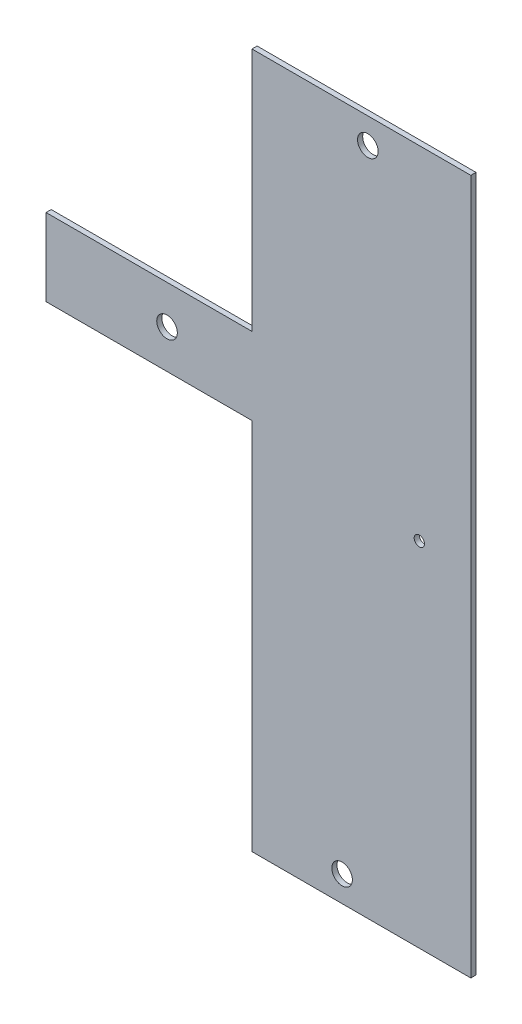
ISO-10303-21;
HEADER;
FILE_DESCRIPTION(('STEP AP214'),'2;1');
FILE_NAME('part.step','',(''),(''),'','','');
FILE_SCHEMA(('AUTOMOTIVE_DESIGN { 1 0 10303 214 1 1 1 1 }'));
ENDSEC;
DATA;
#1=APPLICATION_CONTEXT('core data for automotive mechanical design processes');
#2=APPLICATION_PROTOCOL_DEFINITION('international standard','automotive_design',2000,#1);
#3=PRODUCT_CONTEXT('',#1,'mechanical');
#4=PRODUCT('Part','Part','',(#3));
#5=PRODUCT_RELATED_PRODUCT_CATEGORY('part','',(#4));
#6=PRODUCT_DEFINITION_FORMATION('','',#4);
#7=PRODUCT_DEFINITION_CONTEXT('part definition',#1,'design');
#8=PRODUCT_DEFINITION('design','',#6,#7);
#9=PRODUCT_DEFINITION_SHAPE('','',#8);
#10=(LENGTH_UNIT() NAMED_UNIT(*) SI_UNIT(.MILLI.,.METRE.));
#11=(NAMED_UNIT(*) PLANE_ANGLE_UNIT() SI_UNIT($,.RADIAN.));
#12=(NAMED_UNIT(*) SI_UNIT($,.STERADIAN.) SOLID_ANGLE_UNIT());
#13=UNCERTAINTY_MEASURE_WITH_UNIT(LENGTH_MEASURE(1.E-05),#10,'distance_accuracy_value','');
#14=(GEOMETRIC_REPRESENTATION_CONTEXT(3) GLOBAL_UNCERTAINTY_ASSIGNED_CONTEXT((#13)) GLOBAL_UNIT_ASSIGNED_CONTEXT((#10,
#11,#12)) REPRESENTATION_CONTEXT('',''));
#15=CARTESIAN_POINT('',(0.,0.,0.));
#16=DIRECTION('',(0.,0.,1.));
#17=DIRECTION('',(1.,0.,0.));
#18=AXIS2_PLACEMENT_3D('',#15,#16,#17);
#19=CARTESIAN_POINT('',(-71.5961399548884,-15.3968397565747,2.));
#20=DIRECTION('',(1.,0.,0.));
#21=DIRECTION('',(0.,0.,-1.));
#22=AXIS2_PLACEMENT_3D('',#19,#20,#21);
#23=PLANE('',#22);
#24=DIRECTION('',(0.,-1.,0.));
#25=VECTOR('',#24,1.);
#26=CARTESIAN_POINT('',(-71.5961399548884,-15.3968397565747,0.));
#27=LINE('',#26,#25);
#28=CARTESIAN_POINT('',(-71.5961399548884,14.6031602434253,0.));
#29=VERTEX_POINT('',#28);
#30=CARTESIAN_POINT('',(-71.5961399548884,-15.3968397565747,0.));
#31=VERTEX_POINT('',#30);
#32=EDGE_CURVE('E129',#29,#31,#27,.T.);
#33=ORIENTED_EDGE('',*,*,#32,.T.);
#34=DIRECTION('',(0.,0.,-1.));
#35=VECTOR('',#34,1.);
#36=CARTESIAN_POINT('',(-71.5961399548884,-15.3968397565747,2.));
#37=LINE('',#36,#35);
#38=CARTESIAN_POINT('',(-71.5961399548884,-15.3968397565747,2.));
#39=VERTEX_POINT('',#38);
#40=EDGE_CURVE('E11',#39,#31,#37,.T.);
#41=ORIENTED_EDGE('',*,*,#40,.F.);
#42=DIRECTION('',(0.,-1.,0.));
#43=VECTOR('',#42,1.);
#44=CARTESIAN_POINT('',(-71.5961399548884,-15.3968397565747,2.));
#45=LINE('',#44,#43);
#46=CARTESIAN_POINT('',(-71.5961399548884,14.6031602434253,2.));
#47=VERTEX_POINT('',#46);
#48=EDGE_CURVE('E144',#47,#39,#45,.T.);
#49=ORIENTED_EDGE('',*,*,#48,.F.);
#50=DIRECTION('',(0.,0.,-1.));
#51=VECTOR('',#50,1.);
#52=CARTESIAN_POINT('',(-71.5961399548884,14.6031602434253,2.));
#53=LINE('',#52,#51);
#54=EDGE_CURVE('E125',#47,#29,#53,.T.);
#55=ORIENTED_EDGE('',*,*,#54,.T.);
#56=EDGE_LOOP('',(#33,#41,#49,#55));
#57=FACE_BOUND('',#56,.T.);
#58=ADVANCED_FACE('F33',(#57),#23,.F.);
#59=CARTESIAN_POINT('',(8.40386004511165,-15.3968397565747,2.));
#60=DIRECTION('',(0.,1.,0.));
#61=DIRECTION('',(-1.,0.,0.));
#62=AXIS2_PLACEMENT_3D('',#59,#60,#61);
#63=PLANE('',#62);
#64=DIRECTION('',(1.,0.,0.));
#65=VECTOR('',#64,1.);
#66=CARTESIAN_POINT('',(8.40386004511165,-15.3968397565747,0.));
#67=LINE('',#66,#65);
#68=CARTESIAN_POINT('',(8.40386004511165,-15.3968397565747,0.));
#69=VERTEX_POINT('',#68);
#70=EDGE_CURVE('E132',#31,#69,#67,.T.);
#71=ORIENTED_EDGE('',*,*,#70,.T.);
#72=DIRECTION('',(0.,0.,-1.));
#73=VECTOR('',#72,1.);
#74=CARTESIAN_POINT('',(8.40386004511165,-15.3968397565747,2.));
#75=LINE('',#74,#73);
#76=CARTESIAN_POINT('',(8.40386004511165,-15.3968397565747,2.));
#77=VERTEX_POINT('',#76);
#78=EDGE_CURVE('E41',#77,#69,#75,.T.);
#79=ORIENTED_EDGE('',*,*,#78,.F.);
#80=DIRECTION('',(1.,0.,0.));
#81=VECTOR('',#80,1.);
#82=CARTESIAN_POINT('',(8.40386004511165,-15.3968397565747,2.));
#83=LINE('',#82,#81);
#84=EDGE_CURVE('E92',#39,#77,#83,.T.);
#85=ORIENTED_EDGE('',*,*,#84,.F.);
#86=ORIENTED_EDGE('',*,*,#40,.T.);
#87=EDGE_LOOP('',(#71,#79,#85,#86));
#88=FACE_BOUND('',#87,.T.);
#89=ADVANCED_FACE('F232',(#88),#63,.F.);
#90=CARTESIAN_POINT('',(8.40386004511165,-160.396839756575,2.));
#91=DIRECTION('',(1.,0.,0.));
#92=DIRECTION('',(0.,0.,-1.));
#93=AXIS2_PLACEMENT_3D('',#90,#91,#92);
#94=PLANE('',#93);
#95=DIRECTION('',(0.,-1.,0.));
#96=VECTOR('',#95,1.);
#97=CARTESIAN_POINT('',(8.40386004511165,-160.396839756575,0.));
#98=LINE('',#97,#96);
#99=CARTESIAN_POINT('',(8.40386004511165,-160.396839756575,0.));
#100=VERTEX_POINT('',#99);
#101=EDGE_CURVE('E135',#69,#100,#98,.T.);
#102=ORIENTED_EDGE('',*,*,#101,.T.);
#103=DIRECTION('',(0.,0.,-1.));
#104=VECTOR('',#103,1.);
#105=CARTESIAN_POINT('',(8.40386004511165,-160.396839756575,2.));
#106=LINE('',#105,#104);
#107=CARTESIAN_POINT('',(8.40386004511165,-160.396839756575,2.));
#108=VERTEX_POINT('',#107);
#109=EDGE_CURVE('E151',#108,#100,#106,.T.);
#110=ORIENTED_EDGE('',*,*,#109,.F.);
#111=DIRECTION('',(0.,-1.,0.));
#112=VECTOR('',#111,1.);
#113=CARTESIAN_POINT('',(8.40386004511165,-160.396839756575,2.));
#114=LINE('',#113,#112);
#115=EDGE_CURVE('E159',#77,#108,#114,.T.);
#116=ORIENTED_EDGE('',*,*,#115,.F.);
#117=ORIENTED_EDGE('',*,*,#78,.T.);
#118=EDGE_LOOP('',(#102,#110,#116,#117));
#119=FACE_BOUND('',#118,.T.);
#120=ADVANCED_FACE('F157',(#119),#94,.F.);
#121=CARTESIAN_POINT('',(93.4038600451117,-160.396839756575,2.));
#122=DIRECTION('',(0.,1.,0.));
#123=DIRECTION('',(0.,0.,1.));
#124=AXIS2_PLACEMENT_3D('',#121,#122,#123);
#125=PLANE('',#124);
#126=DIRECTION('',(1.,0.,0.));
#127=VECTOR('',#126,1.);
#128=CARTESIAN_POINT('',(93.4038600451117,-160.396839756575,0.));
#129=LINE('',#128,#127);
#130=CARTESIAN_POINT('',(93.4038600451117,-160.396839756575,0.));
#131=VERTEX_POINT('',#130);
#132=EDGE_CURVE('E137',#100,#131,#129,.T.);
#133=ORIENTED_EDGE('',*,*,#132,.T.);
#134=DIRECTION('',(0.,0.,-1.));
#135=VECTOR('',#134,1.);
#136=CARTESIAN_POINT('',(93.4038600451117,-160.396839756575,2.));
#137=LINE('',#136,#135);
#138=CARTESIAN_POINT('',(93.4038600451117,-160.396839756575,2.));
#139=VERTEX_POINT('',#138);
#140=EDGE_CURVE('E148',#139,#131,#137,.T.);
#141=ORIENTED_EDGE('',*,*,#140,.F.);
#142=DIRECTION('',(1.,0.,0.));
#143=VECTOR('',#142,1.);
#144=CARTESIAN_POINT('',(93.4038600451117,-160.396839756575,2.));
#145=LINE('',#144,#143);
#146=EDGE_CURVE('E171',#108,#139,#145,.T.);
#147=ORIENTED_EDGE('',*,*,#146,.F.);
#148=ORIENTED_EDGE('',*,*,#109,.T.);
#149=EDGE_LOOP('',(#133,#141,#147,#148));
#150=FACE_BOUND('',#149,.T.);
#151=ADVANCED_FACE('F167',(#150),#125,.F.);
#152=CARTESIAN_POINT('',(93.4038600451116,109.603160243425,2.));
#153=DIRECTION('',(-1.,0.,0.));
#154=DIRECTION('',(0.,-1.,0.));
#155=AXIS2_PLACEMENT_3D('',#152,#153,#154);
#156=PLANE('',#155);
#157=DIRECTION('',(0.,1.,0.));
#158=VECTOR('',#157,1.);
#159=CARTESIAN_POINT('',(93.4038600451116,109.603160243425,0.));
#160=LINE('',#159,#158);
#161=CARTESIAN_POINT('',(93.4038600451116,109.603160243425,0.));
#162=VERTEX_POINT('',#161);
#163=EDGE_CURVE('E139',#131,#162,#160,.T.);
#164=ORIENTED_EDGE('',*,*,#163,.T.);
#165=DIRECTION('',(0.,0.,-1.));
#166=VECTOR('',#165,1.);
#167=CARTESIAN_POINT('',(93.4038600451116,109.603160243425,2.));
#168=LINE('',#167,#166);
#169=CARTESIAN_POINT('',(93.4038600451116,109.603160243425,2.));
#170=VERTEX_POINT('',#169);
#171=EDGE_CURVE('E120',#170,#162,#168,.T.);
#172=ORIENTED_EDGE('',*,*,#171,.F.);
#173=DIRECTION('',(0.,1.,0.));
#174=VECTOR('',#173,1.);
#175=CARTESIAN_POINT('',(93.4038600451116,109.603160243425,2.));
#176=LINE('',#175,#174);
#177=EDGE_CURVE('E111',#139,#170,#176,.T.);
#178=ORIENTED_EDGE('',*,*,#177,.F.);
#179=ORIENTED_EDGE('',*,*,#140,.T.);
#180=EDGE_LOOP('',(#164,#172,#178,#179));
#181=FACE_BOUND('',#180,.T.);
#182=ADVANCED_FACE('F170',(#181),#156,.F.);
#183=CARTESIAN_POINT('',(8.40386004511165,109.603160243425,2.));
#184=DIRECTION('',(0.,-1.,0.));
#185=DIRECTION('',(0.,0.,-1.));
#186=AXIS2_PLACEMENT_3D('',#183,#184,#185);
#187=PLANE('',#186);
#188=DIRECTION('',(-1.,0.,0.));
#189=VECTOR('',#188,1.);
#190=CARTESIAN_POINT('',(8.40386004511165,109.603160243425,0.));
#191=LINE('',#190,#189);
#192=CARTESIAN_POINT('',(8.40386004511165,109.603160243425,0.));
#193=VERTEX_POINT('',#192);
#194=EDGE_CURVE('E119',#162,#193,#191,.T.);
#195=ORIENTED_EDGE('',*,*,#194,.T.);
#196=DIRECTION('',(0.,0.,-1.));
#197=VECTOR('',#196,1.);
#198=CARTESIAN_POINT('',(8.40386004511165,109.603160243425,2.));
#199=LINE('',#198,#197);
#200=CARTESIAN_POINT('',(8.40386004511165,109.603160243425,2.));
#201=VERTEX_POINT('',#200);
#202=EDGE_CURVE('E116',#201,#193,#199,.T.);
#203=ORIENTED_EDGE('',*,*,#202,.F.);
#204=DIRECTION('',(-1.,0.,0.));
#205=VECTOR('',#204,1.);
#206=CARTESIAN_POINT('',(8.40386004511165,109.603160243425,2.));
#207=LINE('',#206,#205);
#208=EDGE_CURVE('E105',#170,#201,#207,.T.);
#209=ORIENTED_EDGE('',*,*,#208,.F.);
#210=ORIENTED_EDGE('',*,*,#171,.T.);
#211=EDGE_LOOP('',(#195,#203,#209,#210));
#212=FACE_BOUND('',#211,.T.);
#213=ADVANCED_FACE('F117',(#212),#187,.F.);
#214=CARTESIAN_POINT('',(8.40386004511165,14.6031602434253,2.));
#215=DIRECTION('',(1.,0.,0.));
#216=DIRECTION('',(0.,0.,-1.));
#217=AXIS2_PLACEMENT_3D('',#214,#215,#216);
#218=PLANE('',#217);
#219=DIRECTION('',(0.,-1.,0.));
#220=VECTOR('',#219,1.);
#221=CARTESIAN_POINT('',(8.40386004511165,14.6031602434253,0.));
#222=LINE('',#221,#220);
#223=CARTESIAN_POINT('',(8.40386004511165,14.6031602434253,0.));
#224=VERTEX_POINT('',#223);
#225=EDGE_CURVE('E78',#193,#224,#222,.T.);
#226=ORIENTED_EDGE('',*,*,#225,.T.);
#227=DIRECTION('',(0.,0.,-1.));
#228=VECTOR('',#227,1.);
#229=CARTESIAN_POINT('',(8.40386004511165,14.6031602434253,2.));
#230=LINE('',#229,#228);
#231=CARTESIAN_POINT('',(8.40386004511165,14.6031602434253,2.));
#232=VERTEX_POINT('',#231);
#233=EDGE_CURVE('E121',#232,#224,#230,.T.);
#234=ORIENTED_EDGE('',*,*,#233,.F.);
#235=DIRECTION('',(0.,-1.,0.));
#236=VECTOR('',#235,1.);
#237=CARTESIAN_POINT('',(8.40386004511165,14.6031602434253,2.));
#238=LINE('',#237,#236);
#239=EDGE_CURVE('E109',#201,#232,#238,.T.);
#240=ORIENTED_EDGE('',*,*,#239,.F.);
#241=ORIENTED_EDGE('',*,*,#202,.T.);
#242=EDGE_LOOP('',(#226,#234,#240,#241));
#243=FACE_BOUND('',#242,.T.);
#244=ADVANCED_FACE('F123',(#243),#218,.F.);
#245=CARTESIAN_POINT('',(-71.5961399548884,14.6031602434253,2.));
#246=DIRECTION('',(0.,-1.,0.));
#247=DIRECTION('',(0.,0.,-1.));
#248=AXIS2_PLACEMENT_3D('',#245,#246,#247);
#249=PLANE('',#248);
#250=DIRECTION('',(-1.,0.,0.));
#251=VECTOR('',#250,1.);
#252=CARTESIAN_POINT('',(-71.5961399548884,14.6031602434253,0.));
#253=LINE('',#252,#251);
#254=EDGE_CURVE('E84',#224,#29,#253,.T.);
#255=ORIENTED_EDGE('',*,*,#254,.T.);
#256=ORIENTED_EDGE('',*,*,#54,.F.);
#257=DIRECTION('',(-1.,0.,0.));
#258=VECTOR('',#257,1.);
#259=CARTESIAN_POINT('',(-71.5961399548884,14.6031602434253,2.));
#260=LINE('',#259,#258);
#261=EDGE_CURVE('E49',#232,#47,#260,.T.);
#262=ORIENTED_EDGE('',*,*,#261,.F.);
#263=ORIENTED_EDGE('',*,*,#233,.T.);
#264=EDGE_LOOP('',(#255,#256,#262,#263));
#265=FACE_BOUND('',#264,.T.);
#266=ADVANCED_FACE('F239',(#265),#249,.F.);
#267=CARTESIAN_POINT('',(-71.5961399548884,14.6031602434253,2.));
#268=DIRECTION('',(0.,0.,-1.));
#269=DIRECTION('',(-1.,0.,0.));
#270=AXIS2_PLACEMENT_3D('',#267,#268,#269);
#271=PLANE('',#270);
#272=CARTESIAN_POINT('',(43.4038600451116,-150.396839756575,2.));
#273=DIRECTION('',(0.,0.,-1.));
#274=DIRECTION('',(-1.,0.,0.));
#275=AXIS2_PLACEMENT_3D('',#272,#273,#274);
#276=CIRCLE('',#275,4.00000000000001);
#277=CARTESIAN_POINT('',(39.4038600451116,-150.396839756575,2.));
#278=VERTEX_POINT('',#277);
#279=EDGE_CURVE('E192',#278,#278,#276,.T.);
#280=ORIENTED_EDGE('',*,*,#279,.T.);
#281=EDGE_LOOP('',(#280));
#282=FACE_BOUND('',#281,.T.);
#283=CARTESIAN_POINT('',(73.4039600451117,-23.3968397565747,2.));
#284=DIRECTION('',(0.,0.,-1.));
#285=DIRECTION('',(-1.,0.,0.));
#286=AXIS2_PLACEMENT_3D('',#283,#284,#285);
#287=CIRCLE('',#286,2.00000000000001);
#288=CARTESIAN_POINT('',(71.4039600451116,-23.3968397565747,2.));
#289=VERTEX_POINT('',#288);
#290=EDGE_CURVE('E186',#289,#289,#287,.T.);
#291=ORIENTED_EDGE('',*,*,#290,.T.);
#292=EDGE_LOOP('',(#291));
#293=FACE_BOUND('',#292,.T.);
#294=CARTESIAN_POINT('',(-24.5961399548884,-0.396839756574743,2.));
#295=DIRECTION('',(0.,0.,-1.));
#296=DIRECTION('',(-1.,0.,0.));
#297=AXIS2_PLACEMENT_3D('',#294,#295,#296);
#298=CIRCLE('',#297,4.);
#299=CARTESIAN_POINT('',(-28.5961399548884,-0.396839756574743,2.));
#300=VERTEX_POINT('',#299);
#301=EDGE_CURVE('E180',#300,#300,#298,.T.);
#302=ORIENTED_EDGE('',*,*,#301,.T.);
#303=EDGE_LOOP('',(#302));
#304=FACE_BOUND('',#303,.T.);
#305=CARTESIAN_POINT('',(53.4038600451116,99.6031602434253,2.));
#306=DIRECTION('',(0.,0.,-1.));
#307=DIRECTION('',(-1.,0.,0.));
#308=AXIS2_PLACEMENT_3D('',#305,#306,#307);
#309=CIRCLE('',#308,4.00000000000001);
#310=CARTESIAN_POINT('',(49.4038600451116,99.6031602434253,2.));
#311=VERTEX_POINT('',#310);
#312=EDGE_CURVE('E133',#311,#311,#309,.T.);
#313=ORIENTED_EDGE('',*,*,#312,.T.);
#314=EDGE_LOOP('',(#313));
#315=FACE_BOUND('',#314,.T.);
#316=ORIENTED_EDGE('',*,*,#48,.T.);
#317=ORIENTED_EDGE('',*,*,#84,.T.);
#318=ORIENTED_EDGE('',*,*,#115,.T.);
#319=ORIENTED_EDGE('',*,*,#146,.T.);
#320=ORIENTED_EDGE('',*,*,#177,.T.);
#321=ORIENTED_EDGE('',*,*,#208,.T.);
#322=ORIENTED_EDGE('',*,*,#239,.T.);
#323=ORIENTED_EDGE('',*,*,#261,.T.);
#324=EDGE_LOOP('',(#316,#317,#318,#319,#320,#321,#322,#323));
#325=FACE_BOUND('',#324,.T.);
#326=ADVANCED_FACE('F107',(#282,#293,#304,#315,#325),#271,.F.);
#327=CARTESIAN_POINT('',(-71.5961399548884,14.6031602434253,0.));
#328=DIRECTION('',(0.,0.,-1.));
#329=DIRECTION('',(-1.,0.,0.));
#330=AXIS2_PLACEMENT_3D('',#327,#328,#329);
#331=PLANE('',#330);
#332=CARTESIAN_POINT('',(43.4038600451116,-150.396839756575,0.));
#333=DIRECTION('',(0.,0.,-1.));
#334=DIRECTION('',(-1.,0.,0.));
#335=AXIS2_PLACEMENT_3D('',#332,#333,#334);
#336=CIRCLE('',#335,4.00000000000001);
#337=CARTESIAN_POINT('',(39.4038600451116,-150.396839756575,0.));
#338=VERTEX_POINT('',#337);
#339=EDGE_CURVE('E195',#338,#338,#336,.T.);
#340=ORIENTED_EDGE('',*,*,#339,.F.);
#341=EDGE_LOOP('',(#340));
#342=FACE_BOUND('',#341,.T.);
#343=CARTESIAN_POINT('',(73.4039600451117,-23.3968397565747,0.));
#344=DIRECTION('',(0.,0.,-1.));
#345=DIRECTION('',(-1.,0.,0.));
#346=AXIS2_PLACEMENT_3D('',#343,#344,#345);
#347=CIRCLE('',#346,2.00000000000001);
#348=CARTESIAN_POINT('',(71.4039600451116,-23.3968397565747,0.));
#349=VERTEX_POINT('',#348);
#350=EDGE_CURVE('E189',#349,#349,#347,.T.);
#351=ORIENTED_EDGE('',*,*,#350,.F.);
#352=EDGE_LOOP('',(#351));
#353=FACE_BOUND('',#352,.T.);
#354=CARTESIAN_POINT('',(-24.5961399548884,-0.396839756574743,0.));
#355=DIRECTION('',(0.,0.,-1.));
#356=DIRECTION('',(-1.,0.,0.));
#357=AXIS2_PLACEMENT_3D('',#354,#355,#356);
#358=CIRCLE('',#357,4.);
#359=CARTESIAN_POINT('',(-28.5961399548884,-0.396839756574743,0.));
#360=VERTEX_POINT('',#359);
#361=EDGE_CURVE('E183',#360,#360,#358,.T.);
#362=ORIENTED_EDGE('',*,*,#361,.F.);
#363=EDGE_LOOP('',(#362));
#364=FACE_BOUND('',#363,.T.);
#365=CARTESIAN_POINT('',(53.4038600451116,99.6031602434253,0.));
#366=DIRECTION('',(0.,0.,-1.));
#367=DIRECTION('',(-1.,0.,0.));
#368=AXIS2_PLACEMENT_3D('',#365,#366,#367);
#369=CIRCLE('',#368,4.00000000000001);
#370=CARTESIAN_POINT('',(49.4038600451116,99.6031602434253,0.));
#371=VERTEX_POINT('',#370);
#372=EDGE_CURVE('E177',#371,#371,#369,.T.);
#373=ORIENTED_EDGE('',*,*,#372,.F.);
#374=EDGE_LOOP('',(#373));
#375=FACE_BOUND('',#374,.T.);
#376=ORIENTED_EDGE('',*,*,#32,.F.);
#377=ORIENTED_EDGE('',*,*,#254,.F.);
#378=ORIENTED_EDGE('',*,*,#225,.F.);
#379=ORIENTED_EDGE('',*,*,#194,.F.);
#380=ORIENTED_EDGE('',*,*,#163,.F.);
#381=ORIENTED_EDGE('',*,*,#132,.F.);
#382=ORIENTED_EDGE('',*,*,#101,.F.);
#383=ORIENTED_EDGE('',*,*,#70,.F.);
#384=EDGE_LOOP('',(#376,#377,#378,#379,#380,#381,#382,#383));
#385=FACE_BOUND('',#384,.T.);
#386=ADVANCED_FACE('F163',(#342,#353,#364,#375,#385),#331,.T.);
#387=CARTESIAN_POINT('',(53.4038600451116,99.6031602434253,2.));
#388=DIRECTION('',(0.,0.,-1.));
#389=DIRECTION('',(-1.,0.,0.));
#390=AXIS2_PLACEMENT_3D('',#387,#388,#389);
#391=CYLINDRICAL_SURFACE('',#390,4.00000000000001);
#392=ORIENTED_EDGE('',*,*,#312,.F.);
#393=EDGE_LOOP('',(#392));
#394=FACE_BOUND('',#393,.T.);
#395=ORIENTED_EDGE('',*,*,#372,.T.);
#396=EDGE_LOOP('',(#395));
#397=FACE_BOUND('',#396,.T.);
#398=ADVANCED_FACE('F212',(#394,#397),#391,.F.);
#399=CARTESIAN_POINT('',(-24.5961399548884,-0.396839756574743,2.));
#400=DIRECTION('',(0.,0.,-1.));
#401=DIRECTION('',(-1.,0.,0.));
#402=AXIS2_PLACEMENT_3D('',#399,#400,#401);
#403=CYLINDRICAL_SURFACE('',#402,4.);
#404=ORIENTED_EDGE('',*,*,#301,.F.);
#405=EDGE_LOOP('',(#404));
#406=FACE_BOUND('',#405,.T.);
#407=ORIENTED_EDGE('',*,*,#361,.T.);
#408=EDGE_LOOP('',(#407));
#409=FACE_BOUND('',#408,.T.);
#410=ADVANCED_FACE('F221',(#406,#409),#403,.F.);
#411=CARTESIAN_POINT('',(73.4039600451117,-23.3968397565747,2.));
#412=DIRECTION('',(0.,0.,-1.));
#413=DIRECTION('',(-1.,0.,0.));
#414=AXIS2_PLACEMENT_3D('',#411,#412,#413);
#415=CYLINDRICAL_SURFACE('',#414,2.00000000000001);
#416=ORIENTED_EDGE('',*,*,#290,.F.);
#417=EDGE_LOOP('',(#416));
#418=FACE_BOUND('',#417,.T.);
#419=ORIENTED_EDGE('',*,*,#350,.T.);
#420=EDGE_LOOP('',(#419));
#421=FACE_BOUND('',#420,.T.);
#422=ADVANCED_FACE('F206',(#418,#421),#415,.F.);
#423=CARTESIAN_POINT('',(43.4038600451116,-150.396839756575,2.));
#424=DIRECTION('',(0.,0.,-1.));
#425=DIRECTION('',(-1.,0.,0.));
#426=AXIS2_PLACEMENT_3D('',#423,#424,#425);
#427=CYLINDRICAL_SURFACE('',#426,4.00000000000001);
#428=ORIENTED_EDGE('',*,*,#279,.F.);
#429=EDGE_LOOP('',(#428));
#430=FACE_BOUND('',#429,.T.);
#431=ORIENTED_EDGE('',*,*,#339,.T.);
#432=EDGE_LOOP('',(#431));
#433=FACE_BOUND('',#432,.T.);
#434=ADVANCED_FACE('F203',(#430,#433),#427,.F.);
#435=CLOSED_SHELL('',(#58,#89,#120,#151,#182,#213,#244,#266,#326,#386,#398,#410,#422,#434));
#436=MANIFOLD_SOLID_BREP('B2',#435);
#437=ADVANCED_BREP_SHAPE_REPRESENTATION('',(#18,#436),#14);
#438=SHAPE_DEFINITION_REPRESENTATION(#9,#437);
ENDSEC;
END-ISO-10303-21;
